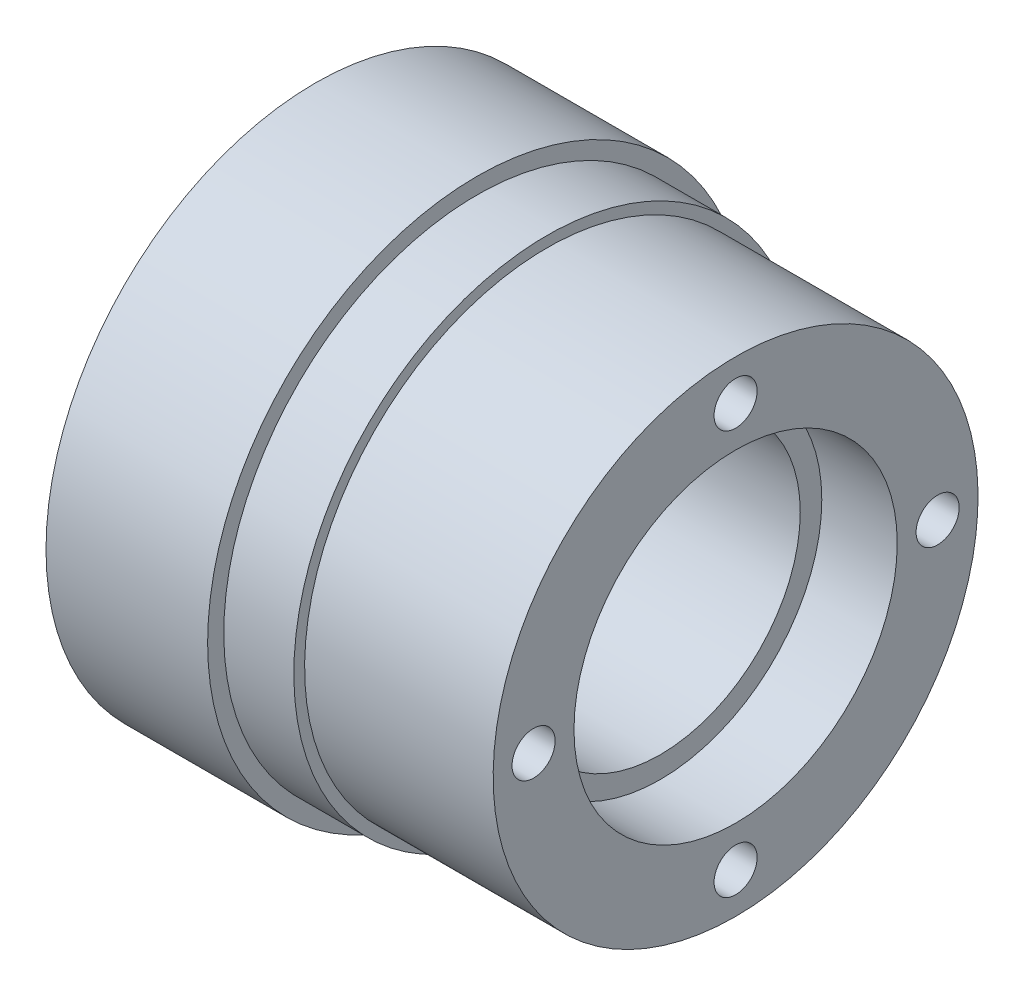
ISO-10303-21;
HEADER;
FILE_DESCRIPTION(('STEP AP214'),'2;1');
FILE_NAME('part.step','',(''),(''),'','','');
FILE_SCHEMA(('AUTOMOTIVE_DESIGN { 1 0 10303 214 1 1 1 1 }'));
ENDSEC;
DATA;
#1=APPLICATION_CONTEXT('core data for automotive mechanical design processes');
#2=APPLICATION_PROTOCOL_DEFINITION('international standard','automotive_design',2000,#1);
#3=PRODUCT_CONTEXT('',#1,'mechanical');
#4=PRODUCT('Part','Part','',(#3));
#5=PRODUCT_RELATED_PRODUCT_CATEGORY('part','',(#4));
#6=PRODUCT_DEFINITION_FORMATION('','',#4);
#7=PRODUCT_DEFINITION_CONTEXT('part definition',#1,'design');
#8=PRODUCT_DEFINITION('design','',#6,#7);
#9=PRODUCT_DEFINITION_SHAPE('','',#8);
#10=(LENGTH_UNIT() NAMED_UNIT(*) SI_UNIT(.MILLI.,.METRE.));
#11=(NAMED_UNIT(*) PLANE_ANGLE_UNIT() SI_UNIT($,.RADIAN.));
#12=(NAMED_UNIT(*) SI_UNIT($,.STERADIAN.) SOLID_ANGLE_UNIT());
#13=UNCERTAINTY_MEASURE_WITH_UNIT(LENGTH_MEASURE(1.E-05),#10,'distance_accuracy_value','');
#14=(GEOMETRIC_REPRESENTATION_CONTEXT(3) GLOBAL_UNCERTAINTY_ASSIGNED_CONTEXT((#13)) GLOBAL_UNIT_ASSIGNED_CONTEXT((#10,
#11,#12)) REPRESENTATION_CONTEXT('',''));
#15=CARTESIAN_POINT('',(0.,0.,0.));
#16=DIRECTION('',(0.,0.,1.));
#17=DIRECTION('',(1.,0.,0.));
#18=AXIS2_PLACEMENT_3D('',#15,#16,#17);
#19=CARTESIAN_POINT('',(-19.5,25.,0.));
#20=DIRECTION('',(1.,0.,0.));
#21=DIRECTION('',(0.,1.,0.));
#22=AXIS2_PLACEMENT_3D('',#19,#20,#21);
#23=PLANE('',#22);
#24=CARTESIAN_POINT('',(-19.5,19.25,0.));
#25=DIRECTION('',(-1.,0.,0.));
#26=DIRECTION('',(0.,0.,1.));
#27=AXIS2_PLACEMENT_3D('',#24,#25,#26);
#28=CIRCLE('',#27,2.);
#29=CARTESIAN_POINT('',(-19.5,19.25,2.));
#30=VERTEX_POINT('',#29);
#31=EDGE_CURVE('E129',#30,#30,#28,.T.);
#32=ORIENTED_EDGE('',*,*,#31,.F.);
#33=EDGE_LOOP('',(#32));
#34=FACE_BOUND('',#33,.T.);
#35=CARTESIAN_POINT('',(-19.5,0.,19.25));
#36=DIRECTION('',(-1.,0.,0.));
#37=DIRECTION('',(0.,0.,1.));
#38=AXIS2_PLACEMENT_3D('',#35,#36,#37);
#39=CIRCLE('',#38,2.);
#40=CARTESIAN_POINT('',(-19.5,0.,21.25));
#41=VERTEX_POINT('',#40);
#42=EDGE_CURVE('E126',#41,#41,#39,.T.);
#43=ORIENTED_EDGE('',*,*,#42,.F.);
#44=EDGE_LOOP('',(#43));
#45=FACE_BOUND('',#44,.T.);
#46=CARTESIAN_POINT('',(-19.5,-19.25,-1.34422031545461E-13));
#47=DIRECTION('',(-1.,0.,0.));
#48=DIRECTION('',(0.,0.,1.));
#49=AXIS2_PLACEMENT_3D('',#46,#47,#48);
#50=CIRCLE('',#49,2.);
#51=CARTESIAN_POINT('',(-19.5,-19.25,1.99999999999987));
#52=VERTEX_POINT('',#51);
#53=EDGE_CURVE('E120',#52,#52,#50,.T.);
#54=ORIENTED_EDGE('',*,*,#53,.F.);
#55=EDGE_LOOP('',(#54));
#56=FACE_BOUND('',#55,.T.);
#57=CARTESIAN_POINT('',(-19.5,1.98050955430685E-13,-19.25));
#58=DIRECTION('',(-1.,0.,0.));
#59=DIRECTION('',(0.,0.,1.));
#60=AXIS2_PLACEMENT_3D('',#57,#58,#59);
#61=CIRCLE('',#60,2.);
#62=CARTESIAN_POINT('',(-19.5,1.98050955430685E-13,-17.25));
#63=VERTEX_POINT('',#62);
#64=EDGE_CURVE('E114',#63,#63,#61,.T.);
#65=ORIENTED_EDGE('',*,*,#64,.F.);
#66=EDGE_LOOP('',(#65));
#67=FACE_BOUND('',#66,.T.);
#68=CARTESIAN_POINT('',(-19.5,0.,0.));
#69=DIRECTION('',(-1.,0.,0.));
#70=DIRECTION('',(0.,-1.,0.));
#71=AXIS2_PLACEMENT_3D('',#68,#69,#70);
#72=CIRCLE('',#71,13.5);
#73=CARTESIAN_POINT('',(-19.5,-13.5,0.));
#74=VERTEX_POINT('',#73);
#75=EDGE_CURVE('E10',#74,#74,#72,.T.);
#76=ORIENTED_EDGE('',*,*,#75,.F.);
#77=EDGE_LOOP('',(#76));
#78=FACE_BOUND('',#77,.T.);
#79=CARTESIAN_POINT('',(-19.5,0.,0.));
#80=DIRECTION('',(-1.,0.,0.));
#81=DIRECTION('',(0.,-1.,0.));
#82=AXIS2_PLACEMENT_3D('',#79,#80,#81);
#83=CIRCLE('',#82,25.);
#84=CARTESIAN_POINT('',(-19.5,-25.,0.));
#85=VERTEX_POINT('',#84);
#86=EDGE_CURVE('E83',#85,#85,#83,.T.);
#87=ORIENTED_EDGE('',*,*,#86,.T.);
#88=EDGE_LOOP('',(#87));
#89=FACE_BOUND('',#88,.T.);
#90=ADVANCED_FACE('F43',(#34,#45,#56,#67,#78,#89),#23,.F.);
#91=CARTESIAN_POINT('',(-19.5,0.,0.));
#92=DIRECTION('',(-1.,0.,0.));
#93=DIRECTION('',(0.,-1.,0.));
#94=AXIS2_PLACEMENT_3D('',#91,#92,#93);
#95=CYLINDRICAL_SURFACE('',#94,13.5);
#96=CARTESIAN_POINT('',(-15.3,0.,0.));
#97=DIRECTION('',(-1.,0.,0.));
#98=DIRECTION('',(0.,-1.,0.));
#99=AXIS2_PLACEMENT_3D('',#96,#97,#98);
#100=CIRCLE('',#99,13.5);
#101=CARTESIAN_POINT('',(-15.3,-13.5,0.));
#102=VERTEX_POINT('',#101);
#103=EDGE_CURVE('E49',#102,#102,#100,.T.);
#104=ORIENTED_EDGE('',*,*,#103,.F.);
#105=EDGE_LOOP('',(#104));
#106=FACE_BOUND('',#105,.T.);
#107=ORIENTED_EDGE('',*,*,#75,.T.);
#108=EDGE_LOOP('',(#107));
#109=FACE_BOUND('',#108,.T.);
#110=ADVANCED_FACE('F146',(#106,#109),#95,.F.);
#111=CARTESIAN_POINT('',(-15.3,13.5,0.));
#112=DIRECTION('',(1.,0.,0.));
#113=DIRECTION('',(0.,1.,0.));
#114=AXIS2_PLACEMENT_3D('',#111,#112,#113);
#115=PLANE('',#114);
#116=CARTESIAN_POINT('',(-15.3,0.,0.));
#117=DIRECTION('',(-1.,0.,0.));
#118=DIRECTION('',(0.,-1.,0.));
#119=AXIS2_PLACEMENT_3D('',#116,#117,#118);
#120=CIRCLE('',#119,13.);
#121=CARTESIAN_POINT('',(-15.3,-13.,0.));
#122=VERTEX_POINT('',#121);
#123=EDGE_CURVE('E53',#122,#122,#120,.T.);
#124=ORIENTED_EDGE('',*,*,#123,.F.);
#125=EDGE_LOOP('',(#124));
#126=FACE_BOUND('',#125,.T.);
#127=ORIENTED_EDGE('',*,*,#103,.T.);
#128=EDGE_LOOP('',(#127));
#129=FACE_BOUND('',#128,.T.);
#130=ADVANCED_FACE('F209',(#126,#129),#115,.F.);
#131=CARTESIAN_POINT('',(-19.5,0.,0.));
#132=DIRECTION('',(-1.,0.,0.));
#133=DIRECTION('',(0.,-1.,0.));
#134=AXIS2_PLACEMENT_3D('',#131,#132,#133);
#135=CYLINDRICAL_SURFACE('',#134,13.);
#136=CARTESIAN_POINT('',(12.5,0.,0.));
#137=DIRECTION('',(-1.,0.,0.));
#138=DIRECTION('',(0.,-1.,0.));
#139=AXIS2_PLACEMENT_3D('',#136,#137,#138);
#140=CIRCLE('',#139,13.);
#141=CARTESIAN_POINT('',(12.5,-13.,0.));
#142=VERTEX_POINT('',#141);
#143=EDGE_CURVE('E57',#142,#142,#140,.T.);
#144=ORIENTED_EDGE('',*,*,#143,.F.);
#145=EDGE_LOOP('',(#144));
#146=FACE_BOUND('',#145,.T.);
#147=ORIENTED_EDGE('',*,*,#123,.T.);
#148=EDGE_LOOP('',(#147));
#149=FACE_BOUND('',#148,.T.);
#150=ADVANCED_FACE('F203',(#146,#149),#135,.F.);
#151=CARTESIAN_POINT('',(12.5,13.,0.));
#152=DIRECTION('',(-1.,0.,0.));
#153=DIRECTION('',(0.,-1.,0.));
#154=AXIS2_PLACEMENT_3D('',#151,#152,#153);
#155=PLANE('',#154);
#156=CARTESIAN_POINT('',(12.5,0.,0.));
#157=DIRECTION('',(-1.,0.,0.));
#158=DIRECTION('',(0.,-1.,0.));
#159=AXIS2_PLACEMENT_3D('',#156,#157,#158);
#160=CIRCLE('',#159,15.);
#161=CARTESIAN_POINT('',(12.5,-15.,0.));
#162=VERTEX_POINT('',#161);
#163=EDGE_CURVE('E62',#162,#162,#160,.T.);
#164=ORIENTED_EDGE('',*,*,#163,.F.);
#165=EDGE_LOOP('',(#164));
#166=FACE_BOUND('',#165,.T.);
#167=ORIENTED_EDGE('',*,*,#143,.T.);
#168=EDGE_LOOP('',(#167));
#169=FACE_BOUND('',#168,.T.);
#170=ADVANCED_FACE('F197',(#166,#169),#155,.F.);
#171=CARTESIAN_POINT('',(-19.5,0.,0.));
#172=DIRECTION('',(-1.,0.,0.));
#173=DIRECTION('',(0.,-1.,0.));
#174=AXIS2_PLACEMENT_3D('',#171,#172,#173);
#175=CYLINDRICAL_SURFACE('',#174,15.);
#176=CARTESIAN_POINT('',(19.5,0.,0.));
#177=DIRECTION('',(-1.,0.,0.));
#178=DIRECTION('',(0.,-1.,0.));
#179=AXIS2_PLACEMENT_3D('',#176,#177,#178);
#180=CIRCLE('',#179,15.);
#181=CARTESIAN_POINT('',(19.5,-15.,0.));
#182=VERTEX_POINT('',#181);
#183=EDGE_CURVE('E65',#182,#182,#180,.T.);
#184=ORIENTED_EDGE('',*,*,#183,.F.);
#185=EDGE_LOOP('',(#184));
#186=FACE_BOUND('',#185,.T.);
#187=ORIENTED_EDGE('',*,*,#163,.T.);
#188=EDGE_LOOP('',(#187));
#189=FACE_BOUND('',#188,.T.);
#190=ADVANCED_FACE('F190',(#186,#189),#175,.F.);
#191=CARTESIAN_POINT('',(19.5,15.,0.));
#192=DIRECTION('',(-1.,0.,0.));
#193=DIRECTION('',(0.,-1.,0.));
#194=AXIS2_PLACEMENT_3D('',#191,#192,#193);
#195=PLANE('',#194);
#196=CARTESIAN_POINT('',(19.5,18.75,0.));
#197=DIRECTION('',(1.,0.,0.));
#198=DIRECTION('',(0.,0.,-1.));
#199=AXIS2_PLACEMENT_3D('',#196,#197,#198);
#200=CIRCLE('',#199,2.);
#201=CARTESIAN_POINT('',(19.5,18.75,-2.));
#202=VERTEX_POINT('',#201);
#203=EDGE_CURVE('E106',#202,#202,#200,.T.);
#204=ORIENTED_EDGE('',*,*,#203,.F.);
#205=EDGE_LOOP('',(#204));
#206=FACE_BOUND('',#205,.T.);
#207=CARTESIAN_POINT('',(19.5,0.,-18.7500000000005));
#208=DIRECTION('',(1.,0.,0.));
#209=DIRECTION('',(0.,0.,-1.));
#210=AXIS2_PLACEMENT_3D('',#207,#208,#209);
#211=CIRCLE('',#210,1.99999999999987);
#212=CARTESIAN_POINT('',(19.5,0.,-20.7500000000003));
#213=VERTEX_POINT('',#212);
#214=EDGE_CURVE('E103',#213,#213,#211,.T.);
#215=ORIENTED_EDGE('',*,*,#214,.F.);
#216=EDGE_LOOP('',(#215));
#217=FACE_BOUND('',#216,.T.);
#218=CARTESIAN_POINT('',(19.5,-18.7500000000005,-3.96190739649633E-13));
#219=DIRECTION('',(1.,0.,0.));
#220=DIRECTION('',(0.,0.,-1.));
#221=AXIS2_PLACEMENT_3D('',#218,#219,#220);
#222=CIRCLE('',#221,2.00000000000035);
#223=CARTESIAN_POINT('',(19.5,-18.7500000000005,-2.00000000000075));
#224=VERTEX_POINT('',#223);
#225=EDGE_CURVE('E97',#224,#224,#222,.T.);
#226=ORIENTED_EDGE('',*,*,#225,.F.);
#227=EDGE_LOOP('',(#226));
#228=FACE_BOUND('',#227,.T.);
#229=CARTESIAN_POINT('',(19.5,-4.56788390807397E-13,18.7500000000001));
#230=DIRECTION('',(1.,0.,0.));
#231=DIRECTION('',(0.,0.,-1.));
#232=AXIS2_PLACEMENT_3D('',#229,#230,#231);
#233=CIRCLE('',#232,2.00000000000061);
#234=CARTESIAN_POINT('',(19.5,-4.56788390807397E-13,16.7499999999995));
#235=VERTEX_POINT('',#234);
#236=EDGE_CURVE('E90',#235,#235,#233,.T.);
#237=ORIENTED_EDGE('',*,*,#236,.F.);
#238=EDGE_LOOP('',(#237));
#239=FACE_BOUND('',#238,.T.);
#240=CARTESIAN_POINT('',(19.5,0.,0.));
#241=DIRECTION('',(-1.,0.,0.));
#242=DIRECTION('',(0.,-1.,0.));
#243=AXIS2_PLACEMENT_3D('',#240,#241,#242);
#244=CIRCLE('',#243,22.5);
#245=CARTESIAN_POINT('',(19.5,-22.5,0.));
#246=VERTEX_POINT('',#245);
#247=EDGE_CURVE('E68',#246,#246,#244,.T.);
#248=ORIENTED_EDGE('',*,*,#247,.F.);
#249=EDGE_LOOP('',(#248));
#250=FACE_BOUND('',#249,.T.);
#251=ORIENTED_EDGE('',*,*,#183,.T.);
#252=EDGE_LOOP('',(#251));
#253=FACE_BOUND('',#252,.T.);
#254=ADVANCED_FACE('F184',(#206,#217,#228,#239,#250,#253),#195,.F.);
#255=CARTESIAN_POINT('',(-19.5,0.,0.));
#256=DIRECTION('',(-1.,0.,0.));
#257=DIRECTION('',(0.,-1.,0.));
#258=AXIS2_PLACEMENT_3D('',#255,#256,#257);
#259=CYLINDRICAL_SURFACE('',#258,22.5);
#260=CARTESIAN_POINT('',(2.,0.,0.));
#261=DIRECTION('',(-1.,0.,0.));
#262=DIRECTION('',(0.,-1.,0.));
#263=AXIS2_PLACEMENT_3D('',#260,#261,#262);
#264=CIRCLE('',#263,22.5);
#265=CARTESIAN_POINT('',(2.00000000000001,-22.5,0.));
#266=VERTEX_POINT('',#265);
#267=EDGE_CURVE('E71',#266,#266,#264,.T.);
#268=ORIENTED_EDGE('',*,*,#267,.F.);
#269=EDGE_LOOP('',(#268));
#270=FACE_BOUND('',#269,.T.);
#271=ORIENTED_EDGE('',*,*,#247,.T.);
#272=EDGE_LOOP('',(#271));
#273=FACE_BOUND('',#272,.T.);
#274=ADVANCED_FACE('F178',(#270,#273),#259,.T.);
#275=CARTESIAN_POINT('',(2.,22.5,0.));
#276=DIRECTION('',(-1.,0.,0.));
#277=DIRECTION('',(0.,-1.,0.));
#278=AXIS2_PLACEMENT_3D('',#275,#276,#277);
#279=PLANE('',#278);
#280=CARTESIAN_POINT('',(2.,0.,0.));
#281=DIRECTION('',(-1.,0.,0.));
#282=DIRECTION('',(0.,-1.,0.));
#283=AXIS2_PLACEMENT_3D('',#280,#281,#282);
#284=CIRCLE('',#283,23.5);
#285=CARTESIAN_POINT('',(2.00000000000001,-23.5,0.));
#286=VERTEX_POINT('',#285);
#287=EDGE_CURVE('E74',#286,#286,#284,.T.);
#288=ORIENTED_EDGE('',*,*,#287,.F.);
#289=EDGE_LOOP('',(#288));
#290=FACE_BOUND('',#289,.T.);
#291=ORIENTED_EDGE('',*,*,#267,.T.);
#292=EDGE_LOOP('',(#291));
#293=FACE_BOUND('',#292,.T.);
#294=ADVANCED_FACE('F172',(#290,#293),#279,.F.);
#295=CARTESIAN_POINT('',(-19.5,0.,0.));
#296=DIRECTION('',(-1.,0.,0.));
#297=DIRECTION('',(0.,-1.,0.));
#298=AXIS2_PLACEMENT_3D('',#295,#296,#297);
#299=CYLINDRICAL_SURFACE('',#298,23.5);
#300=CARTESIAN_POINT('',(-4.5,0.,0.));
#301=DIRECTION('',(-1.,0.,0.));
#302=DIRECTION('',(0.,-1.,0.));
#303=AXIS2_PLACEMENT_3D('',#300,#301,#302);
#304=CIRCLE('',#303,23.5);
#305=CARTESIAN_POINT('',(-4.49999999999999,-23.5,0.));
#306=VERTEX_POINT('',#305);
#307=EDGE_CURVE('E77',#306,#306,#304,.T.);
#308=ORIENTED_EDGE('',*,*,#307,.F.);
#309=EDGE_LOOP('',(#308));
#310=FACE_BOUND('',#309,.T.);
#311=ORIENTED_EDGE('',*,*,#287,.T.);
#312=EDGE_LOOP('',(#311));
#313=FACE_BOUND('',#312,.T.);
#314=ADVANCED_FACE('F166',(#310,#313),#299,.T.);
#315=CARTESIAN_POINT('',(-4.5,23.5,0.));
#316=DIRECTION('',(-1.,0.,0.));
#317=DIRECTION('',(0.,-1.,0.));
#318=AXIS2_PLACEMENT_3D('',#315,#316,#317);
#319=PLANE('',#318);
#320=CARTESIAN_POINT('',(-4.5,0.,0.));
#321=DIRECTION('',(-1.,0.,0.));
#322=DIRECTION('',(0.,-1.,0.));
#323=AXIS2_PLACEMENT_3D('',#320,#321,#322);
#324=CIRCLE('',#323,25.);
#325=CARTESIAN_POINT('',(-4.49999999999999,-25.,0.));
#326=VERTEX_POINT('',#325);
#327=EDGE_CURVE('E80',#326,#326,#324,.T.);
#328=ORIENTED_EDGE('',*,*,#327,.F.);
#329=EDGE_LOOP('',(#328));
#330=FACE_BOUND('',#329,.T.);
#331=ORIENTED_EDGE('',*,*,#307,.T.);
#332=EDGE_LOOP('',(#331));
#333=FACE_BOUND('',#332,.T.);
#334=ADVANCED_FACE('F160',(#330,#333),#319,.F.);
#335=CARTESIAN_POINT('',(-19.5,0.,0.));
#336=DIRECTION('',(-1.,0.,0.));
#337=DIRECTION('',(0.,-1.,0.));
#338=AXIS2_PLACEMENT_3D('',#335,#336,#337);
#339=CYLINDRICAL_SURFACE('',#338,25.);
#340=ORIENTED_EDGE('',*,*,#86,.F.);
#341=EDGE_LOOP('',(#340));
#342=FACE_BOUND('',#341,.T.);
#343=ORIENTED_EDGE('',*,*,#327,.T.);
#344=EDGE_LOOP('',(#343));
#345=FACE_BOUND('',#344,.T.);
#346=ADVANCED_FACE('F156',(#342,#345),#339,.T.);
#347=CARTESIAN_POINT('',(9.5,-4.56788390807397E-13,18.7500000000001));
#348=DIRECTION('',(1.,0.,0.));
#349=DIRECTION('',(0.,0.,-1.));
#350=AXIS2_PLACEMENT_3D('',#347,#348,#349);
#351=CYLINDRICAL_SURFACE('',#350,2.00000000000061);
#352=CARTESIAN_POINT('',(9.5,-4.56788390807397E-13,18.7500000000001));
#353=DIRECTION('',(1.,0.,0.));
#354=DIRECTION('',(0.,0.,-1.));
#355=AXIS2_PLACEMENT_3D('',#352,#353,#354);
#356=CIRCLE('',#355,2.00000000000061);
#357=CARTESIAN_POINT('',(9.5,-4.56788390807397E-13,16.7499999999995));
#358=VERTEX_POINT('',#357);
#359=EDGE_CURVE('E87',#358,#358,#356,.T.);
#360=ORIENTED_EDGE('',*,*,#359,.F.);
#361=EDGE_LOOP('',(#360));
#362=FACE_BOUND('',#361,.T.);
#363=ORIENTED_EDGE('',*,*,#236,.T.);
#364=EDGE_LOOP('',(#363));
#365=FACE_BOUND('',#364,.T.);
#366=ADVANCED_FACE('F159',(#362,#365),#351,.F.);
#367=CARTESIAN_POINT('',(9.5,-4.56788390807397E-13,18.7500000000001));
#368=DIRECTION('',(1.,0.,0.));
#369=DIRECTION('',(0.,0.,-1.));
#370=AXIS2_PLACEMENT_3D('',#367,#368,#369);
#371=PLANE('',#370);
#372=ORIENTED_EDGE('',*,*,#359,.T.);
#373=EDGE_LOOP('',(#372));
#374=FACE_BOUND('',#373,.T.);
#375=ADVANCED_FACE('F220',(#374),#371,.T.);
#376=CARTESIAN_POINT('',(9.5,-18.7500000000005,-3.96190739649633E-13));
#377=DIRECTION('',(1.,0.,0.));
#378=DIRECTION('',(0.,0.,-1.));
#379=AXIS2_PLACEMENT_3D('',#376,#377,#378);
#380=CYLINDRICAL_SURFACE('',#379,2.00000000000035);
#381=CARTESIAN_POINT('',(9.5,-18.7500000000005,-3.96190739649633E-13));
#382=DIRECTION('',(1.,0.,0.));
#383=DIRECTION('',(0.,0.,-1.));
#384=AXIS2_PLACEMENT_3D('',#381,#382,#383);
#385=CIRCLE('',#384,2.00000000000035);
#386=CARTESIAN_POINT('',(9.5,-18.7500000000005,-2.00000000000075));
#387=VERTEX_POINT('',#386);
#388=EDGE_CURVE('E94',#387,#387,#385,.T.);
#389=ORIENTED_EDGE('',*,*,#388,.F.);
#390=EDGE_LOOP('',(#389));
#391=FACE_BOUND('',#390,.T.);
#392=ORIENTED_EDGE('',*,*,#225,.T.);
#393=EDGE_LOOP('',(#392));
#394=FACE_BOUND('',#393,.T.);
#395=ADVANCED_FACE('F223',(#391,#394),#380,.F.);
#396=CARTESIAN_POINT('',(9.5,-18.7500000000005,-3.96190739649633E-13));
#397=DIRECTION('',(1.,0.,0.));
#398=DIRECTION('',(0.,0.,-1.));
#399=AXIS2_PLACEMENT_3D('',#396,#397,#398);
#400=PLANE('',#399);
#401=ORIENTED_EDGE('',*,*,#388,.T.);
#402=EDGE_LOOP('',(#401));
#403=FACE_BOUND('',#402,.T.);
#404=ADVANCED_FACE('F228',(#403),#400,.T.);
#405=CARTESIAN_POINT('',(9.5,0.,-18.7500000000005));
#406=DIRECTION('',(1.,0.,0.));
#407=DIRECTION('',(0.,0.,-1.));
#408=AXIS2_PLACEMENT_3D('',#405,#406,#407);
#409=CYLINDRICAL_SURFACE('',#408,1.99999999999987);
#410=CARTESIAN_POINT('',(9.5,0.,-18.7500000000005));
#411=DIRECTION('',(1.,0.,0.));
#412=DIRECTION('',(0.,0.,-1.));
#413=AXIS2_PLACEMENT_3D('',#410,#411,#412);
#414=CIRCLE('',#413,1.99999999999987);
#415=CARTESIAN_POINT('',(9.5,0.,-20.7500000000003));
#416=VERTEX_POINT('',#415);
#417=EDGE_CURVE('E100',#416,#416,#414,.T.);
#418=ORIENTED_EDGE('',*,*,#417,.F.);
#419=EDGE_LOOP('',(#418));
#420=FACE_BOUND('',#419,.T.);
#421=ORIENTED_EDGE('',*,*,#214,.T.);
#422=EDGE_LOOP('',(#421));
#423=FACE_BOUND('',#422,.T.);
#424=ADVANCED_FACE('F231',(#420,#423),#409,.F.);
#425=CARTESIAN_POINT('',(9.5,0.,-18.7500000000005));
#426=DIRECTION('',(1.,0.,0.));
#427=DIRECTION('',(0.,0.,-1.));
#428=AXIS2_PLACEMENT_3D('',#425,#426,#427);
#429=PLANE('',#428);
#430=ORIENTED_EDGE('',*,*,#417,.T.);
#431=EDGE_LOOP('',(#430));
#432=FACE_BOUND('',#431,.T.);
#433=ADVANCED_FACE('F236',(#432),#429,.T.);
#434=CARTESIAN_POINT('',(9.5,18.75,0.));
#435=DIRECTION('',(1.,0.,0.));
#436=DIRECTION('',(0.,0.,-1.));
#437=AXIS2_PLACEMENT_3D('',#434,#435,#436);
#438=CYLINDRICAL_SURFACE('',#437,2.);
#439=CARTESIAN_POINT('',(9.5,18.75,0.));
#440=DIRECTION('',(1.,0.,0.));
#441=DIRECTION('',(0.,0.,-1.));
#442=AXIS2_PLACEMENT_3D('',#439,#440,#441);
#443=CIRCLE('',#442,2.);
#444=CARTESIAN_POINT('',(9.5,18.75,-2.));
#445=VERTEX_POINT('',#444);
#446=EDGE_CURVE('E86',#445,#445,#443,.T.);
#447=ORIENTED_EDGE('',*,*,#446,.F.);
#448=EDGE_LOOP('',(#447));
#449=FACE_BOUND('',#448,.T.);
#450=ORIENTED_EDGE('',*,*,#203,.T.);
#451=EDGE_LOOP('',(#450));
#452=FACE_BOUND('',#451,.T.);
#453=ADVANCED_FACE('F239',(#449,#452),#438,.F.);
#454=CARTESIAN_POINT('',(9.5,18.75,0.));
#455=DIRECTION('',(1.,0.,0.));
#456=DIRECTION('',(0.,0.,-1.));
#457=AXIS2_PLACEMENT_3D('',#454,#455,#456);
#458=PLANE('',#457);
#459=ORIENTED_EDGE('',*,*,#446,.T.);
#460=EDGE_LOOP('',(#459));
#461=FACE_BOUND('',#460,.T.);
#462=ADVANCED_FACE('F246',(#461),#458,.T.);
#463=CARTESIAN_POINT('',(-9.5,1.98050955430685E-13,-19.25));
#464=DIRECTION('',(-1.,0.,0.));
#465=DIRECTION('',(0.,0.,1.));
#466=AXIS2_PLACEMENT_3D('',#463,#464,#465);
#467=CYLINDRICAL_SURFACE('',#466,2.);
#468=CARTESIAN_POINT('',(-9.5,1.98050955430685E-13,-19.25));
#469=DIRECTION('',(-1.,0.,0.));
#470=DIRECTION('',(0.,0.,1.));
#471=AXIS2_PLACEMENT_3D('',#468,#469,#470);
#472=CIRCLE('',#471,2.);
#473=CARTESIAN_POINT('',(-9.5,1.98050955430685E-13,-17.25));
#474=VERTEX_POINT('',#473);
#475=EDGE_CURVE('E111',#474,#474,#472,.T.);
#476=ORIENTED_EDGE('',*,*,#475,.F.);
#477=EDGE_LOOP('',(#476));
#478=FACE_BOUND('',#477,.T.);
#479=ORIENTED_EDGE('',*,*,#64,.T.);
#480=EDGE_LOOP('',(#479));
#481=FACE_BOUND('',#480,.T.);
#482=ADVANCED_FACE('F250',(#478,#481),#467,.F.);
#483=CARTESIAN_POINT('',(-9.5,1.98050955430685E-13,-19.25));
#484=DIRECTION('',(-1.,0.,0.));
#485=DIRECTION('',(0.,0.,1.));
#486=AXIS2_PLACEMENT_3D('',#483,#484,#485);
#487=PLANE('',#486);
#488=ORIENTED_EDGE('',*,*,#475,.T.);
#489=EDGE_LOOP('',(#488));
#490=FACE_BOUND('',#489,.T.);
#491=ADVANCED_FACE('F252',(#490),#487,.T.);
#492=CARTESIAN_POINT('',(-9.5,-19.25,-1.34422031545461E-13));
#493=DIRECTION('',(-1.,0.,0.));
#494=DIRECTION('',(0.,0.,1.));
#495=AXIS2_PLACEMENT_3D('',#492,#493,#494);
#496=CYLINDRICAL_SURFACE('',#495,2.);
#497=CARTESIAN_POINT('',(-9.5,-19.25,-1.34422031545461E-13));
#498=DIRECTION('',(-1.,0.,0.));
#499=DIRECTION('',(0.,0.,1.));
#500=AXIS2_PLACEMENT_3D('',#497,#498,#499);
#501=CIRCLE('',#500,2.);
#502=CARTESIAN_POINT('',(-9.5,-19.25,1.99999999999987));
#503=VERTEX_POINT('',#502);
#504=EDGE_CURVE('E117',#503,#503,#501,.T.);
#505=ORIENTED_EDGE('',*,*,#504,.F.);
#506=EDGE_LOOP('',(#505));
#507=FACE_BOUND('',#506,.T.);
#508=ORIENTED_EDGE('',*,*,#53,.T.);
#509=EDGE_LOOP('',(#508));
#510=FACE_BOUND('',#509,.T.);
#511=ADVANCED_FACE('F255',(#507,#510),#496,.F.);
#512=CARTESIAN_POINT('',(-9.5,-19.25,-1.34422031545461E-13));
#513=DIRECTION('',(-1.,0.,0.));
#514=DIRECTION('',(0.,0.,1.));
#515=AXIS2_PLACEMENT_3D('',#512,#513,#514);
#516=PLANE('',#515);
#517=ORIENTED_EDGE('',*,*,#504,.T.);
#518=EDGE_LOOP('',(#517));
#519=FACE_BOUND('',#518,.T.);
#520=ADVANCED_FACE('F260',(#519),#516,.T.);
#521=CARTESIAN_POINT('',(-9.5,0.,19.25));
#522=DIRECTION('',(-1.,0.,0.));
#523=DIRECTION('',(0.,0.,1.));
#524=AXIS2_PLACEMENT_3D('',#521,#522,#523);
#525=CYLINDRICAL_SURFACE('',#524,2.);
#526=CARTESIAN_POINT('',(-9.5,0.,19.25));
#527=DIRECTION('',(-1.,0.,0.));
#528=DIRECTION('',(0.,0.,1.));
#529=AXIS2_PLACEMENT_3D('',#526,#527,#528);
#530=CIRCLE('',#529,2.);
#531=CARTESIAN_POINT('',(-9.5,0.,21.25));
#532=VERTEX_POINT('',#531);
#533=EDGE_CURVE('E123',#532,#532,#530,.T.);
#534=ORIENTED_EDGE('',*,*,#533,.F.);
#535=EDGE_LOOP('',(#534));
#536=FACE_BOUND('',#535,.T.);
#537=ORIENTED_EDGE('',*,*,#42,.T.);
#538=EDGE_LOOP('',(#537));
#539=FACE_BOUND('',#538,.T.);
#540=ADVANCED_FACE('F263',(#536,#539),#525,.F.);
#541=CARTESIAN_POINT('',(-9.5,0.,19.25));
#542=DIRECTION('',(-1.,0.,0.));
#543=DIRECTION('',(0.,0.,1.));
#544=AXIS2_PLACEMENT_3D('',#541,#542,#543);
#545=PLANE('',#544);
#546=ORIENTED_EDGE('',*,*,#533,.T.);
#547=EDGE_LOOP('',(#546));
#548=FACE_BOUND('',#547,.T.);
#549=ADVANCED_FACE('F140',(#548),#545,.T.);
#550=CARTESIAN_POINT('',(-9.5,19.25,0.));
#551=DIRECTION('',(-1.,0.,0.));
#552=DIRECTION('',(0.,0.,1.));
#553=AXIS2_PLACEMENT_3D('',#550,#551,#552);
#554=CYLINDRICAL_SURFACE('',#553,2.);
#555=CARTESIAN_POINT('',(-9.5,19.25,0.));
#556=DIRECTION('',(-1.,0.,0.));
#557=DIRECTION('',(0.,0.,1.));
#558=AXIS2_PLACEMENT_3D('',#555,#556,#557);
#559=CIRCLE('',#558,2.);
#560=CARTESIAN_POINT('',(-9.5,19.25,2.));
#561=VERTEX_POINT('',#560);
#562=EDGE_CURVE('E91',#561,#561,#559,.T.);
#563=ORIENTED_EDGE('',*,*,#562,.F.);
#564=EDGE_LOOP('',(#563));
#565=FACE_BOUND('',#564,.T.);
#566=ORIENTED_EDGE('',*,*,#31,.T.);
#567=EDGE_LOOP('',(#566));
#568=FACE_BOUND('',#567,.T.);
#569=ADVANCED_FACE('F137',(#565,#568),#554,.F.);
#570=CARTESIAN_POINT('',(-9.5,19.25,0.));
#571=DIRECTION('',(-1.,0.,0.));
#572=DIRECTION('',(0.,0.,1.));
#573=AXIS2_PLACEMENT_3D('',#570,#571,#572);
#574=PLANE('',#573);
#575=ORIENTED_EDGE('',*,*,#562,.T.);
#576=EDGE_LOOP('',(#575));
#577=FACE_BOUND('',#576,.T.);
#578=ADVANCED_FACE('F135',(#577),#574,.T.);
#579=CLOSED_SHELL('',(#90,#110,#130,#150,#170,#190,#254,#274,#294,#314,#334,#346,#366,#375,#395,
#404,#424,#433,#453,#462,#482,#491,#511,#520,#540,#549,#569,#578));
#580=MANIFOLD_SOLID_BREP('B2',#579);
#581=ADVANCED_BREP_SHAPE_REPRESENTATION('',(#18,#580),#14);
#582=SHAPE_DEFINITION_REPRESENTATION(#9,#581);
ENDSEC;
END-ISO-10303-21;
